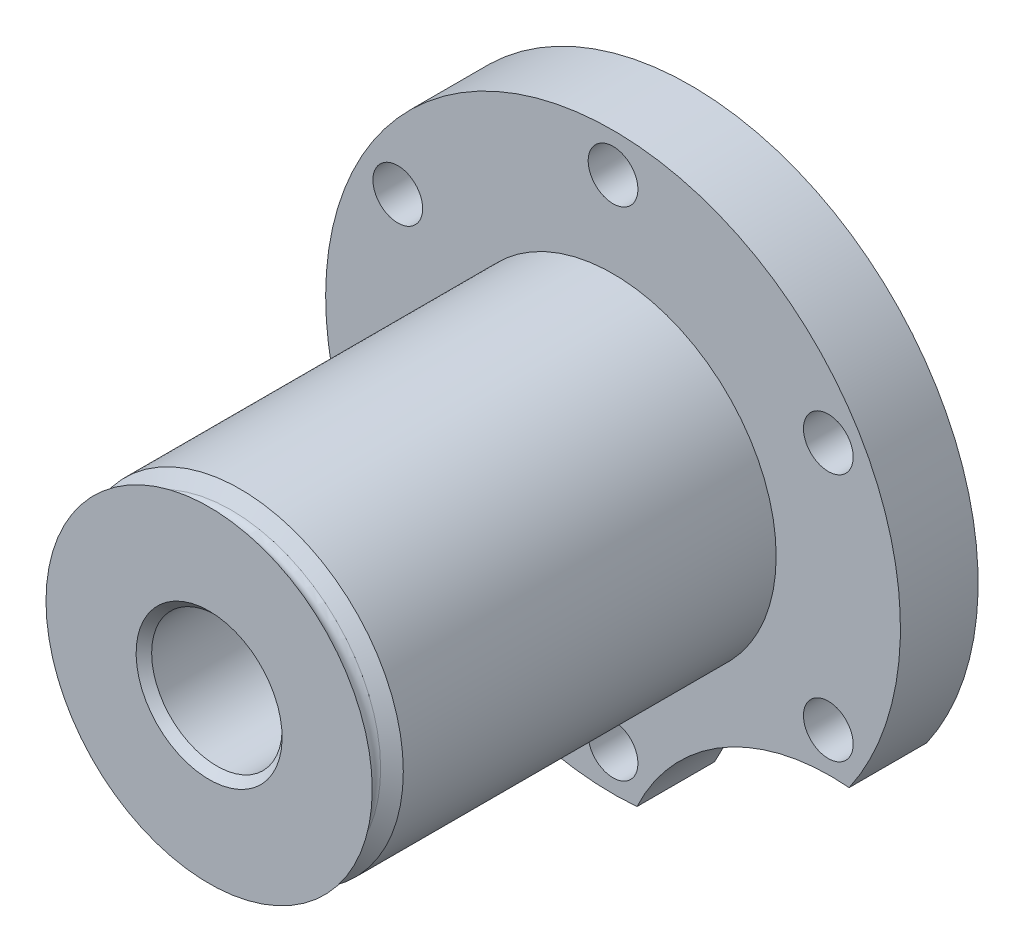
ISO-10303-21;
HEADER;
FILE_DESCRIPTION(('STEP AP214'),'2;1');
FILE_NAME('part.step','',(''),(''),'','','');
FILE_SCHEMA(('AUTOMOTIVE_DESIGN { 1 0 10303 214 1 1 1 1 }'));
ENDSEC;
DATA;
#1=APPLICATION_CONTEXT('core data for automotive mechanical design processes');
#2=APPLICATION_PROTOCOL_DEFINITION('international standard','automotive_design',2000,#1);
#3=PRODUCT_CONTEXT('',#1,'mechanical');
#4=PRODUCT('Part','Part','',(#3));
#5=PRODUCT_RELATED_PRODUCT_CATEGORY('part','',(#4));
#6=PRODUCT_DEFINITION_FORMATION('','',#4);
#7=PRODUCT_DEFINITION_CONTEXT('part definition',#1,'design');
#8=PRODUCT_DEFINITION('design','',#6,#7);
#9=PRODUCT_DEFINITION_SHAPE('','',#8);
#10=(LENGTH_UNIT() NAMED_UNIT(*) SI_UNIT(.MILLI.,.METRE.));
#11=(NAMED_UNIT(*) PLANE_ANGLE_UNIT() SI_UNIT($,.RADIAN.));
#12=(NAMED_UNIT(*) SI_UNIT($,.STERADIAN.) SOLID_ANGLE_UNIT());
#13=UNCERTAINTY_MEASURE_WITH_UNIT(LENGTH_MEASURE(1.E-05),#10,'distance_accuracy_value','');
#14=(GEOMETRIC_REPRESENTATION_CONTEXT(3) GLOBAL_UNCERTAINTY_ASSIGNED_CONTEXT((#13)) GLOBAL_UNIT_ASSIGNED_CONTEXT((#10,
#11,#12)) REPRESENTATION_CONTEXT('',''));
#15=CARTESIAN_POINT('',(0.,0.,0.));
#16=DIRECTION('',(0.,0.,1.));
#17=DIRECTION('',(1.,0.,0.));
#18=AXIS2_PLACEMENT_3D('',#15,#16,#17);
#19=CARTESIAN_POINT('',(0.,0.,0.));
#20=DIRECTION('',(0.,0.,1.));
#21=DIRECTION('',(-0.500000000000032,0.86602540378442,0.));
#22=AXIS2_PLACEMENT_3D('',#19,#20,#21);
#23=CYLINDRICAL_SURFACE('',#22,18.5);
#24=CARTESIAN_POINT('',(0.,0.,0.));
#25=DIRECTION('',(0.,0.,-1.));
#26=DIRECTION('',(0.0831961615416768,-0.996533189966461,0.));
#27=AXIS2_PLACEMENT_3D('',#24,#25,#26);
#28=CIRCLE('',#27,18.5);
#29=CARTESIAN_POINT('',(1.539128988521,-18.43586401438,0.));
#30=VERTEX_POINT('',#29);
#31=CARTESIAN_POINT('',(15.19636208291,-10.55085681095,0.));
#32=VERTEX_POINT('',#31);
#33=EDGE_CURVE('E164',#30,#32,#28,.T.);
#34=ORIENTED_EDGE('',*,*,#33,.F.);
#35=DIRECTION('',(0.,0.,1.));
#36=VECTOR('',#35,1.);
#37=CARTESIAN_POINT('',(1.539128988521,-18.43586401438,0.));
#38=LINE('',#37,#36);
#39=CARTESIAN_POINT('',(1.539128988521,-18.43586401438,5.));
#40=VERTEX_POINT('',#39);
#41=EDGE_CURVE('E27',#30,#40,#38,.T.);
#42=ORIENTED_EDGE('',*,*,#41,.T.);
#43=CARTESIAN_POINT('',(0.,0.,5.));
#44=DIRECTION('',(0.,0.,1.));
#45=DIRECTION('',(0.821424977454463,-0.570316584375674,0.));
#46=AXIS2_PLACEMENT_3D('',#43,#44,#45);
#47=CIRCLE('',#46,18.5);
#48=CARTESIAN_POINT('',(15.19636208291,-10.55085681095,5.));
#49=VERTEX_POINT('',#48);
#50=EDGE_CURVE('E158',#49,#40,#47,.T.);
#51=ORIENTED_EDGE('',*,*,#50,.F.);
#52=DIRECTION('',(0.,0.,1.));
#53=VECTOR('',#52,1.);
#54=CARTESIAN_POINT('',(15.19636208291,-10.55085681095,0.));
#55=LINE('',#54,#53);
#56=EDGE_CURVE('E11',#32,#49,#55,.T.);
#57=ORIENTED_EDGE('',*,*,#56,.F.);
#58=EDGE_LOOP('',(#34,#42,#51,#57));
#59=FACE_BOUND('',#58,.T.);
#60=ADVANCED_FACE('F17',(#59),#23,.T.);
#61=CARTESIAN_POINT('',(14.,-24.24871130596,0.));
#62=DIRECTION('',(0.,0.,1.));
#63=DIRECTION('',(1.,0.,0.));
#64=AXIS2_PLACEMENT_3D('',#61,#62,#63);
#65=CYLINDRICAL_SURFACE('',#64,13.75);
#66=ORIENTED_EDGE('',*,*,#41,.F.);
#67=CARTESIAN_POINT('',(14.,-24.24871130596,0.));
#68=DIRECTION('',(0.,0.,1.));
#69=DIRECTION('',(0.0870081514841798,0.996207599637398,0.));
#70=AXIS2_PLACEMENT_3D('',#67,#68,#69);
#71=CIRCLE('',#70,13.75);
#72=EDGE_CURVE('E160',#32,#30,#71,.T.);
#73=ORIENTED_EDGE('',*,*,#72,.F.);
#74=ORIENTED_EDGE('',*,*,#56,.T.);
#75=CARTESIAN_POINT('',(14.,-24.24871130596,5.));
#76=DIRECTION('',(0.,0.,1.));
#77=DIRECTION('',(0.0870081514841798,0.996207599637398,0.));
#78=AXIS2_PLACEMENT_3D('',#75,#76,#77);
#79=CIRCLE('',#78,13.75);
#80=EDGE_CURVE('E154',#49,#40,#79,.T.);
#81=ORIENTED_EDGE('',*,*,#80,.T.);
#82=EDGE_LOOP('',(#66,#73,#74,#81));
#83=FACE_BOUND('',#82,.T.);
#84=ADVANCED_FACE('F332',(#83),#65,.F.);
#85=CARTESIAN_POINT('',(13.85640646055,-8.,0.));
#86=DIRECTION('',(0.,0.,1.));
#87=DIRECTION('',(0.500000000000017,-0.866025403784429,0.));
#88=AXIS2_PLACEMENT_3D('',#85,#86,#87);
#89=CYLINDRICAL_SURFACE('',#88,1.6);
#90=CARTESIAN_POINT('',(13.85640646055,-8.,0.));
#91=DIRECTION('',(0.,0.,1.));
#92=DIRECTION('',(0.500000000000017,-0.866025403784429,0.));
#93=AXIS2_PLACEMENT_3D('',#90,#91,#92);
#94=CIRCLE('',#93,1.6);
#95=CARTESIAN_POINT('',(13.05640646055,-6.614359353945,0.));
#96=VERTEX_POINT('',#95);
#97=EDGE_CURVE('E171',#96,#96,#94,.T.);
#98=ORIENTED_EDGE('',*,*,#97,.F.);
#99=DIRECTION('',(0.,0.,1.));
#100=VECTOR('',#99,1.);
#101=CARTESIAN_POINT('',(13.05640646055,-6.61435935394491,0.));
#102=LINE('',#101,#100);
#103=CARTESIAN_POINT('',(13.05640646055,-6.614359353945,5.));
#104=VERTEX_POINT('',#103);
#105=EDGE_CURVE('E191',#96,#104,#102,.T.);
#106=ORIENTED_EDGE('',*,*,#105,.T.);
#107=CARTESIAN_POINT('',(13.85640646055,-8.,5.));
#108=DIRECTION('',(0.,0.,1.));
#109=DIRECTION('',(0.500000000000017,-0.866025403784429,0.));
#110=AXIS2_PLACEMENT_3D('',#107,#108,#109);
#111=CIRCLE('',#110,1.6);
#112=EDGE_CURVE('E180',#104,#104,#111,.T.);
#113=ORIENTED_EDGE('',*,*,#112,.T.);
#114=ORIENTED_EDGE('',*,*,#105,.F.);
#115=EDGE_LOOP('',(#98,#106,#113,#114));
#116=FACE_BOUND('',#115,.T.);
#117=ADVANCED_FACE('F534',(#116),#89,.F.);
#118=CARTESIAN_POINT('',(0.,-16.,0.));
#119=DIRECTION('',(0.,0.,1.));
#120=DIRECTION('',(-0.500000000000017,-0.866025403784429,0.));
#121=AXIS2_PLACEMENT_3D('',#118,#119,#120);
#122=CYLINDRICAL_SURFACE('',#121,1.6);
#123=CARTESIAN_POINT('',(0.,-16.,0.));
#124=DIRECTION('',(0.,0.,1.));
#125=DIRECTION('',(-0.500000000000017,-0.866025403784429,0.));
#126=AXIS2_PLACEMENT_3D('',#123,#124,#125);
#127=CIRCLE('',#126,1.6);
#128=CARTESIAN_POINT('',(0.8,-14.61435935394,0.));
#129=VERTEX_POINT('',#128);
#130=EDGE_CURVE('E175',#129,#129,#127,.T.);
#131=ORIENTED_EDGE('',*,*,#130,.F.);
#132=DIRECTION('',(0.,0.,1.));
#133=VECTOR('',#132,1.);
#134=CARTESIAN_POINT('',(0.800000000000027,-14.6143593539449,0.));
#135=LINE('',#134,#133);
#136=CARTESIAN_POINT('',(0.8,-14.61435935394,5.));
#137=VERTEX_POINT('',#136);
#138=EDGE_CURVE('E194',#129,#137,#135,.T.);
#139=ORIENTED_EDGE('',*,*,#138,.T.);
#140=CARTESIAN_POINT('',(0.,-16.,5.));
#141=DIRECTION('',(0.,0.,1.));
#142=DIRECTION('',(-0.500000000000017,-0.866025403784429,0.));
#143=AXIS2_PLACEMENT_3D('',#140,#141,#142);
#144=CIRCLE('',#143,1.6);
#145=EDGE_CURVE('E176',#137,#137,#144,.T.);
#146=ORIENTED_EDGE('',*,*,#145,.T.);
#147=ORIENTED_EDGE('',*,*,#138,.F.);
#148=EDGE_LOOP('',(#131,#139,#146,#147));
#149=FACE_BOUND('',#148,.T.);
#150=ADVANCED_FACE('F528',(#149),#122,.F.);
#151=CARTESIAN_POINT('',(-13.85640646055,-8.,0.));
#152=DIRECTION('',(0.,0.,1.));
#153=DIRECTION('',(-1.,0.,0.));
#154=AXIS2_PLACEMENT_3D('',#151,#152,#153);
#155=CYLINDRICAL_SURFACE('',#154,1.6);
#156=CARTESIAN_POINT('',(-13.85640646055,-8.,0.));
#157=DIRECTION('',(0.,0.,1.));
#158=DIRECTION('',(-1.,0.,0.));
#159=AXIS2_PLACEMENT_3D('',#156,#157,#158);
#160=CIRCLE('',#159,1.6);
#161=CARTESIAN_POINT('',(-12.25640646055,-8.,0.));
#162=VERTEX_POINT('',#161);
#163=EDGE_CURVE('E204',#162,#162,#160,.T.);
#164=ORIENTED_EDGE('',*,*,#163,.F.);
#165=DIRECTION('',(0.,0.,1.));
#166=VECTOR('',#165,1.);
#167=CARTESIAN_POINT('',(-12.25640646055,-8.,0.));
#168=LINE('',#167,#166);
#169=CARTESIAN_POINT('',(-12.25640646055,-8.,5.));
#170=VERTEX_POINT('',#169);
#171=EDGE_CURVE('E148',#162,#170,#168,.T.);
#172=ORIENTED_EDGE('',*,*,#171,.T.);
#173=CARTESIAN_POINT('',(-13.85640646055,-8.,5.));
#174=DIRECTION('',(0.,0.,1.));
#175=DIRECTION('',(-1.,0.,0.));
#176=AXIS2_PLACEMENT_3D('',#173,#174,#175);
#177=CIRCLE('',#176,1.6);
#178=EDGE_CURVE('E181',#170,#170,#177,.T.);
#179=ORIENTED_EDGE('',*,*,#178,.T.);
#180=ORIENTED_EDGE('',*,*,#171,.F.);
#181=EDGE_LOOP('',(#164,#172,#179,#180));
#182=FACE_BOUND('',#181,.T.);
#183=ADVANCED_FACE('F533',(#182),#155,.F.);
#184=CARTESIAN_POINT('',(-13.85640646055,8.,0.));
#185=DIRECTION('',(0.,0.,1.));
#186=DIRECTION('',(-0.500000000000017,0.866025403784429,0.));
#187=AXIS2_PLACEMENT_3D('',#184,#185,#186);
#188=CYLINDRICAL_SURFACE('',#187,1.6);
#189=CARTESIAN_POINT('',(-13.85640646055,8.,0.));
#190=DIRECTION('',(0.,0.,1.));
#191=DIRECTION('',(-0.500000000000017,0.866025403784429,0.));
#192=AXIS2_PLACEMENT_3D('',#189,#190,#191);
#193=CIRCLE('',#192,1.6);
#194=CARTESIAN_POINT('',(-13.05640646055,6.614359353945,0.));
#195=VERTEX_POINT('',#194);
#196=EDGE_CURVE('E208',#195,#195,#193,.T.);
#197=ORIENTED_EDGE('',*,*,#196,.F.);
#198=DIRECTION('',(0.,0.,1.));
#199=VECTOR('',#198,1.);
#200=CARTESIAN_POINT('',(-13.05640646055,6.61435935394491,0.));
#201=LINE('',#200,#199);
#202=CARTESIAN_POINT('',(-13.05640646055,6.614359353945,5.));
#203=VERTEX_POINT('',#202);
#204=EDGE_CURVE('E141',#195,#203,#201,.T.);
#205=ORIENTED_EDGE('',*,*,#204,.T.);
#206=CARTESIAN_POINT('',(-13.85640646055,8.,5.));
#207=DIRECTION('',(0.,0.,1.));
#208=DIRECTION('',(-0.500000000000017,0.866025403784429,0.));
#209=AXIS2_PLACEMENT_3D('',#206,#207,#208);
#210=CIRCLE('',#209,1.6);
#211=EDGE_CURVE('E185',#203,#203,#210,.T.);
#212=ORIENTED_EDGE('',*,*,#211,.T.);
#213=ORIENTED_EDGE('',*,*,#204,.F.);
#214=EDGE_LOOP('',(#197,#205,#212,#213));
#215=FACE_BOUND('',#214,.T.);
#216=ADVANCED_FACE('F541',(#215),#188,.F.);
#217=CARTESIAN_POINT('',(0.,16.,0.));
#218=DIRECTION('',(0.,0.,1.));
#219=DIRECTION('',(0.500000000000017,0.866025403784429,0.));
#220=AXIS2_PLACEMENT_3D('',#217,#218,#219);
#221=CYLINDRICAL_SURFACE('',#220,1.6);
#222=CARTESIAN_POINT('',(0.,16.,0.));
#223=DIRECTION('',(0.,0.,1.));
#224=DIRECTION('',(0.500000000000017,0.866025403784429,0.));
#225=AXIS2_PLACEMENT_3D('',#222,#223,#224);
#226=CIRCLE('',#225,1.6);
#227=CARTESIAN_POINT('',(-0.8,14.61435935394,0.));
#228=VERTEX_POINT('',#227);
#229=EDGE_CURVE('E139',#228,#228,#226,.T.);
#230=ORIENTED_EDGE('',*,*,#229,.F.);
#231=DIRECTION('',(0.,0.,1.));
#232=VECTOR('',#231,1.);
#233=CARTESIAN_POINT('',(-0.800000000000027,14.6143593539449,0.));
#234=LINE('',#233,#232);
#235=CARTESIAN_POINT('',(-0.8,14.61435935394,5.));
#236=VERTEX_POINT('',#235);
#237=EDGE_CURVE('E134',#228,#236,#234,.T.);
#238=ORIENTED_EDGE('',*,*,#237,.T.);
#239=CARTESIAN_POINT('',(0.,16.,5.));
#240=DIRECTION('',(0.,0.,1.));
#241=DIRECTION('',(0.500000000000017,0.866025403784429,0.));
#242=AXIS2_PLACEMENT_3D('',#239,#240,#241);
#243=CIRCLE('',#242,1.6);
#244=EDGE_CURVE('E137',#236,#236,#243,.T.);
#245=ORIENTED_EDGE('',*,*,#244,.T.);
#246=ORIENTED_EDGE('',*,*,#237,.F.);
#247=EDGE_LOOP('',(#230,#238,#245,#246));
#248=FACE_BOUND('',#247,.T.);
#249=ADVANCED_FACE('F135',(#248),#221,.F.);
#250=CARTESIAN_POINT('',(0.,0.,0.2500000014544));
#251=DIRECTION('',(0.,0.,-1.));
#252=DIRECTION('',(0.,-1.,0.));
#253=AXIS2_PLACEMENT_3D('',#250,#251,#252);
#254=CONICAL_SURFACE('',#253,4.449999998546,0.785398163397448);
#255=CARTESIAN_POINT('',(0.,0.,0.5));
#256=DIRECTION('',(0.,0.,1.));
#257=DIRECTION('',(-1.,0.,0.));
#258=AXIS2_PLACEMENT_3D('',#255,#256,#257);
#259=CIRCLE('',#258,4.2);
#260=CARTESIAN_POINT('',(-4.2,0.,0.5));
#261=VERTEX_POINT('',#260);
#262=CARTESIAN_POINT('',(0.,4.2000000000002,0.5000000000002));
#263=VERTEX_POINT('',#262);
#264=EDGE_CURVE('E221',#261,#263,#259,.T.);
#265=ORIENTED_EDGE('',*,*,#264,.T.);
#266=DIRECTION('',(0.,0.707106781186548,-0.707106781186548));
#267=VECTOR('',#266,1.);
#268=CARTESIAN_POINT('',(0.,4.449999998546,0.2500000014544));
#269=LINE('',#268,#267);
#270=CARTESIAN_POINT('',(0.,4.7000000000002,1.99458505267813E-13));
#271=VERTEX_POINT('',#270);
#272=EDGE_CURVE('E41',#263,#271,#269,.T.);
#273=ORIENTED_EDGE('',*,*,#272,.T.);
#274=CARTESIAN_POINT('',(0.,0.,0.));
#275=DIRECTION('',(0.,0.,1.));
#276=DIRECTION('',(1.,0.,0.));
#277=AXIS2_PLACEMENT_3D('',#274,#275,#276);
#278=CIRCLE('',#277,4.7);
#279=EDGE_CURVE('E20',#271,#271,#278,.T.);
#280=ORIENTED_EDGE('',*,*,#279,.F.);
#281=ORIENTED_EDGE('',*,*,#272,.F.);
#282=CARTESIAN_POINT('',(0.,0.,0.5));
#283=DIRECTION('',(0.,0.,1.));
#284=DIRECTION('',(-1.,0.,0.));
#285=AXIS2_PLACEMENT_3D('',#282,#283,#284);
#286=CIRCLE('',#285,4.2);
#287=EDGE_CURVE('E150',#263,#261,#286,.T.);
#288=ORIENTED_EDGE('',*,*,#287,.T.);
#289=EDGE_LOOP('',(#265,#273,#280,#281,#288));
#290=FACE_BOUND('',#289,.T.);
#291=ADVANCED_FACE('F519',(#290),#254,.F.);
#292=CARTESIAN_POINT('',(0.,0.,0.));
#293=DIRECTION('',(0.,0.,1.));
#294=DIRECTION('',(1.,0.,0.));
#295=AXIS2_PLACEMENT_3D('',#292,#293,#294);
#296=CYLINDRICAL_SURFACE('',#295,4.2);
#297=ORIENTED_EDGE('',*,*,#264,.F.);
#298=DIRECTION('',(0.,0.,1.));
#299=VECTOR('',#298,1.);
#300=CARTESIAN_POINT('',(-4.2,0.,0.));
#301=LINE('',#300,#299);
#302=CARTESIAN_POINT('',(-4.2,0.,30.5));
#303=VERTEX_POINT('',#302);
#304=EDGE_CURVE('E214',#261,#303,#301,.T.);
#305=ORIENTED_EDGE('',*,*,#304,.T.);
#306=CARTESIAN_POINT('',(0.,0.,30.5));
#307=DIRECTION('',(0.,0.,-1.));
#308=DIRECTION('',(-1.,0.,0.));
#309=AXIS2_PLACEMENT_3D('',#306,#307,#308);
#310=CIRCLE('',#309,4.2);
#311=CARTESIAN_POINT('',(0.,4.199999999998,30.500000000002));
#312=VERTEX_POINT('',#311);
#313=EDGE_CURVE('E170',#312,#303,#310,.T.);
#314=ORIENTED_EDGE('',*,*,#313,.F.);
#315=CARTESIAN_POINT('',(0.,0.,30.5));
#316=DIRECTION('',(0.,0.,-1.));
#317=DIRECTION('',(-1.,0.,0.));
#318=AXIS2_PLACEMENT_3D('',#315,#316,#317);
#319=CIRCLE('',#318,4.2);
#320=EDGE_CURVE('E165',#303,#312,#319,.T.);
#321=ORIENTED_EDGE('',*,*,#320,.F.);
#322=ORIENTED_EDGE('',*,*,#304,.F.);
#323=ORIENTED_EDGE('',*,*,#287,.F.);
#324=EDGE_LOOP('',(#297,#305,#314,#321,#322,#323));
#325=FACE_BOUND('',#324,.T.);
#326=ADVANCED_FACE('F480',(#325),#296,.F.);
#327=CARTESIAN_POINT('',(0.,0.,30.74999999855));
#328=DIRECTION('',(0.,0.,1.));
#329=DIRECTION('',(0.,-1.,0.));
#330=AXIS2_PLACEMENT_3D('',#327,#328,#329);
#331=CONICAL_SURFACE('',#330,4.449999998546,0.785398163397448);
#332=ORIENTED_EDGE('',*,*,#313,.T.);
#333=ORIENTED_EDGE('',*,*,#320,.T.);
#334=DIRECTION('',(0.,0.707106781186548,0.707106781186548));
#335=VECTOR('',#334,1.);
#336=CARTESIAN_POINT('',(0.,4.449999998546,30.74999999855));
#337=LINE('',#336,#335);
#338=CARTESIAN_POINT('',(0.,4.699999999998,31.000000000002));
#339=VERTEX_POINT('',#338);
#340=EDGE_CURVE('E169',#312,#339,#337,.T.);
#341=ORIENTED_EDGE('',*,*,#340,.T.);
#342=CARTESIAN_POINT('',(0.,0.,31.));
#343=DIRECTION('',(0.,0.,-1.));
#344=DIRECTION('',(-1.,0.,0.));
#345=AXIS2_PLACEMENT_3D('',#342,#343,#344);
#346=CIRCLE('',#345,4.7);
#347=EDGE_CURVE('E186',#339,#339,#346,.T.);
#348=ORIENTED_EDGE('',*,*,#347,.F.);
#349=ORIENTED_EDGE('',*,*,#340,.F.);
#350=EDGE_LOOP('',(#332,#333,#341,#348,#349));
#351=FACE_BOUND('',#350,.T.);
#352=ADVANCED_FACE('F474',(#351),#331,.F.);
#353=CARTESIAN_POINT('',(0.,0.,31.));
#354=DIRECTION('',(0.,0.,1.));
#355=DIRECTION('',(1.,0.,0.));
#356=AXIS2_PLACEMENT_3D('',#353,#354,#355);
#357=PLANE('',#356);
#358=ORIENTED_EDGE('',*,*,#347,.T.);
#359=EDGE_LOOP('',(#358));
#360=FACE_BOUND('',#359,.T.);
#361=CARTESIAN_POINT('',(0.,0.,31.));
#362=DIRECTION('',(0.,0.,-1.));
#363=DIRECTION('',(-1.,0.,0.));
#364=AXIS2_PLACEMENT_3D('',#361,#362,#363);
#365=CIRCLE('',#364,10.5);
#366=CARTESIAN_POINT('',(10.5,0.,31.));
#367=VERTEX_POINT('',#366);
#368=EDGE_CURVE('E278',#367,#367,#365,.T.);
#369=ORIENTED_EDGE('',*,*,#368,.F.);
#370=EDGE_LOOP('',(#369));
#371=FACE_BOUND('',#370,.T.);
#372=ADVANCED_FACE('F479',(#360,#371),#357,.T.);
#373=CARTESIAN_POINT('',(0.,0.,30.70801257358));
#374=DIRECTION('',(0.,0.,1.));
#375=DIRECTION('',(-1.,0.,0.));
#376=AXIS2_PLACEMENT_3D('',#373,#374,#375);
#377=CONICAL_SURFACE('',#376,10.06201886038,0.982793723247326);
#378=ORIENTED_EDGE('',*,*,#368,.T.);
#379=DIRECTION('',(-0.832050294337842,0.,-0.554700196225232));
#380=VECTOR('',#379,1.);
#381=CARTESIAN_POINT('',(10.06201886038,0.,30.70801257358));
#382=LINE('',#381,#380);
#383=CARTESIAN_POINT('',(9.62403772075669,0.,30.4160251471645));
#384=VERTEX_POINT('',#383);
#385=EDGE_CURVE('E190',#367,#384,#382,.T.);
#386=ORIENTED_EDGE('',*,*,#385,.T.);
#387=CARTESIAN_POINT('',(0.,0.,30.41602514717));
#388=DIRECTION('',(0.,0.,-1.));
#389=DIRECTION('',(-1.,0.,0.));
#390=AXIS2_PLACEMENT_3D('',#387,#388,#389);
#391=CIRCLE('',#390,9.624037720753);
#392=CARTESIAN_POINT('',(9.62359503425264,0.0923074600699649,30.41602514717));
#393=VERTEX_POINT('',#392);
#394=EDGE_CURVE('E222',#393,#384,#391,.T.);
#395=ORIENTED_EDGE('',*,*,#394,.F.);
#396=CARTESIAN_POINT('',(0.,0.,30.41602514717));
#397=DIRECTION('',(0.,0.,-1.));
#398=DIRECTION('',(-1.,0.,0.));
#399=AXIS2_PLACEMENT_3D('',#396,#397,#398);
#400=CIRCLE('',#399,9.624037720753);
#401=EDGE_CURVE('E226',#384,#393,#400,.T.);
#402=ORIENTED_EDGE('',*,*,#401,.F.);
#403=ORIENTED_EDGE('',*,*,#385,.F.);
#404=EDGE_LOOP('',(#378,#386,#395,#402,#403));
#405=FACE_BOUND('',#404,.T.);
#406=ADVANCED_FACE('F299',(#405),#377,.T.);
#407=CARTESIAN_POINT('',(0.,0.,30.));
#408=DIRECTION('',(0.,0.,-1.));
#409=DIRECTION('',(-0.99995400199862,-0.00959134437627119,0.));
#410=AXIS2_PLACEMENT_3D('',#407,#408,#409);
#411=TOROIDAL_SURFACE('',#410,9.901387818866,0.5);
#412=CARTESIAN_POINT('',(0.,0.,29.58397485283));
#413=DIRECTION('',(0.,0.,-1.));
#414=DIRECTION('',(-1.,0.,0.));
#415=AXIS2_PLACEMENT_3D('',#412,#413,#414);
#416=CIRCLE('',#415,9.624037720753);
#417=CARTESIAN_POINT('',(-9.624037720753,0.,29.58397485283));
#418=VERTEX_POINT('',#417);
#419=CARTESIAN_POINT('',(9.62359503425264,0.0923074600699649,29.58397485283));
#420=VERTEX_POINT('',#419);
#421=EDGE_CURVE('E201',#418,#420,#416,.T.);
#422=ORIENTED_EDGE('',*,*,#421,.F.);
#423=CARTESIAN_POINT('',(0.,0.,29.58397485283));
#424=DIRECTION('',(0.,0.,-1.));
#425=DIRECTION('',(-1.,0.,0.));
#426=AXIS2_PLACEMENT_3D('',#423,#424,#425);
#427=CIRCLE('',#426,9.624037720753);
#428=EDGE_CURVE('E197',#420,#418,#427,.T.);
#429=ORIENTED_EDGE('',*,*,#428,.F.);
#430=CARTESIAN_POINT('',(9.90093237481544,0.0949676203737593,30.));
#431=DIRECTION('',(-0.00959134437627107,0.99995400199862,0.));
#432=DIRECTION('',(0.99995400199862,0.00959134437627107,0.));
#433=AXIS2_PLACEMENT_3D('',#430,#431,#432);
#434=CIRCLE('',#433,0.5);
#435=EDGE_CURVE('E200',#420,#393,#434,.T.);
#436=ORIENTED_EDGE('',*,*,#435,.T.);
#437=ORIENTED_EDGE('',*,*,#394,.T.);
#438=ORIENTED_EDGE('',*,*,#401,.T.);
#439=ORIENTED_EDGE('',*,*,#435,.F.);
#440=EDGE_LOOP('',(#422,#429,#436,#437,#438,#439));
#441=FACE_BOUND('',#440,.T.);
#442=ADVANCED_FACE('F296',(#441),#411,.F.);
#443=CARTESIAN_POINT('',(0.,0.,29.29198742642));
#444=DIRECTION('',(0.,0.,-1.));
#445=DIRECTION('',(1.,0.,0.));
#446=AXIS2_PLACEMENT_3D('',#443,#444,#445);
#447=CONICAL_SURFACE('',#446,10.06201886038,0.982793723247326);
#448=CARTESIAN_POINT('',(0.,0.,29.));
#449=DIRECTION('',(0.,0.,1.));
#450=DIRECTION('',(1.,0.,0.));
#451=AXIS2_PLACEMENT_3D('',#448,#449,#450);
#452=CIRCLE('',#451,10.5);
#453=CARTESIAN_POINT('',(-10.5,0.,29.));
#454=VERTEX_POINT('',#453);
#455=EDGE_CURVE('E257',#454,#454,#452,.T.);
#456=ORIENTED_EDGE('',*,*,#455,.T.);
#457=DIRECTION('',(0.832050294337842,0.,0.554700196225232));
#458=VECTOR('',#457,1.);
#459=CARTESIAN_POINT('',(-10.06201886038,0.,29.29198742642));
#460=LINE('',#459,#458);
#461=EDGE_CURVE('E218',#454,#418,#460,.T.);
#462=ORIENTED_EDGE('',*,*,#461,.T.);
#463=ORIENTED_EDGE('',*,*,#421,.T.);
#464=ORIENTED_EDGE('',*,*,#428,.T.);
#465=ORIENTED_EDGE('',*,*,#461,.F.);
#466=EDGE_LOOP('',(#456,#462,#463,#464,#465));
#467=FACE_BOUND('',#466,.T.);
#468=ADVANCED_FACE('F304',(#467),#447,.T.);
#469=CARTESIAN_POINT('',(0.,0.,5.));
#470=DIRECTION('',(0.,0.,1.));
#471=DIRECTION('',(1.,0.,0.));
#472=AXIS2_PLACEMENT_3D('',#469,#470,#471);
#473=CYLINDRICAL_SURFACE('',#472,10.5);
#474=ORIENTED_EDGE('',*,*,#455,.F.);
#475=DIRECTION('',(0.,0.,-1.));
#476=VECTOR('',#475,1.);
#477=CARTESIAN_POINT('',(-10.5,0.,5.));
#478=LINE('',#477,#476);
#479=CARTESIAN_POINT('',(-10.5,0.,5.));
#480=VERTEX_POINT('',#479);
#481=EDGE_CURVE('E261',#454,#480,#478,.T.);
#482=ORIENTED_EDGE('',*,*,#481,.T.);
#483=CARTESIAN_POINT('',(0.,0.,5.));
#484=DIRECTION('',(0.,0.,1.));
#485=DIRECTION('',(1.,0.,0.));
#486=AXIS2_PLACEMENT_3D('',#483,#484,#485);
#487=CIRCLE('',#486,10.5);
#488=EDGE_CURVE('E256',#480,#480,#487,.T.);
#489=ORIENTED_EDGE('',*,*,#488,.T.);
#490=ORIENTED_EDGE('',*,*,#481,.F.);
#491=EDGE_LOOP('',(#474,#482,#489,#490));
#492=FACE_BOUND('',#491,.T.);
#493=ADVANCED_FACE('F310',(#492),#473,.T.);
#494=CARTESIAN_POINT('',(0.,0.,5.));
#495=DIRECTION('',(0.,0.,1.));
#496=DIRECTION('',(1.,0.,0.));
#497=AXIS2_PLACEMENT_3D('',#494,#495,#496);
#498=PLANE('',#497);
#499=ORIENTED_EDGE('',*,*,#488,.F.);
#500=EDGE_LOOP('',(#499));
#501=FACE_BOUND('',#500,.T.);
#502=ORIENTED_EDGE('',*,*,#112,.F.);
#503=EDGE_LOOP('',(#502));
#504=FACE_BOUND('',#503,.T.);
#505=ORIENTED_EDGE('',*,*,#145,.F.);
#506=EDGE_LOOP('',(#505));
#507=FACE_BOUND('',#506,.T.);
#508=ORIENTED_EDGE('',*,*,#178,.F.);
#509=EDGE_LOOP('',(#508));
#510=FACE_BOUND('',#509,.T.);
#511=ORIENTED_EDGE('',*,*,#211,.F.);
#512=EDGE_LOOP('',(#511));
#513=FACE_BOUND('',#512,.T.);
#514=ORIENTED_EDGE('',*,*,#244,.F.);
#515=EDGE_LOOP('',(#514));
#516=FACE_BOUND('',#515,.T.);
#517=CARTESIAN_POINT('',(13.85640646055,8.,5.));
#518=DIRECTION('',(0.,0.,1.));
#519=DIRECTION('',(1.,0.,0.));
#520=AXIS2_PLACEMENT_3D('',#517,#518,#519);
#521=CIRCLE('',#520,1.6);
#522=CARTESIAN_POINT('',(12.25640646055,8.,5.));
#523=VERTEX_POINT('',#522);
#524=EDGE_CURVE('E159',#523,#523,#521,.T.);
#525=ORIENTED_EDGE('',*,*,#524,.F.);
#526=EDGE_LOOP('',(#525));
#527=FACE_BOUND('',#526,.T.);
#528=ORIENTED_EDGE('',*,*,#80,.F.);
#529=ORIENTED_EDGE('',*,*,#50,.T.);
#530=EDGE_LOOP('',(#528,#529));
#531=FACE_BOUND('',#530,.T.);
#532=ADVANCED_FACE('F313',(#501,#504,#507,#510,#513,#516,#527,#531),#498,.T.);
#533=CARTESIAN_POINT('',(13.85640646055,8.,0.));
#534=DIRECTION('',(0.,0.,1.));
#535=DIRECTION('',(1.,0.,0.));
#536=AXIS2_PLACEMENT_3D('',#533,#534,#535);
#537=CYLINDRICAL_SURFACE('',#536,1.6);
#538=CARTESIAN_POINT('',(13.85640646055,8.,0.));
#539=DIRECTION('',(0.,0.,1.));
#540=DIRECTION('',(1.,0.,0.));
#541=AXIS2_PLACEMENT_3D('',#538,#539,#540);
#542=CIRCLE('',#541,1.6);
#543=CARTESIAN_POINT('',(12.25640646055,8.,0.));
#544=VERTEX_POINT('',#543);
#545=EDGE_CURVE('E250',#544,#544,#542,.T.);
#546=ORIENTED_EDGE('',*,*,#545,.F.);
#547=DIRECTION('',(0.,0.,1.));
#548=VECTOR('',#547,1.);
#549=CARTESIAN_POINT('',(12.25640646055,8.,0.));
#550=LINE('',#549,#548);
#551=EDGE_CURVE('E246',#544,#523,#550,.T.);
#552=ORIENTED_EDGE('',*,*,#551,.T.);
#553=ORIENTED_EDGE('',*,*,#524,.T.);
#554=ORIENTED_EDGE('',*,*,#551,.F.);
#555=EDGE_LOOP('',(#546,#552,#553,#554));
#556=FACE_BOUND('',#555,.T.);
#557=ADVANCED_FACE('F316',(#556),#537,.F.);
#558=CARTESIAN_POINT('',(0.,0.,0.));
#559=DIRECTION('',(0.,0.,1.));
#560=DIRECTION('',(1.,0.,0.));
#561=AXIS2_PLACEMENT_3D('',#558,#559,#560);
#562=PLANE('',#561);
#563=ORIENTED_EDGE('',*,*,#545,.T.);
#564=EDGE_LOOP('',(#563));
#565=FACE_BOUND('',#564,.T.);
#566=ORIENTED_EDGE('',*,*,#279,.T.);
#567=EDGE_LOOP('',(#566));
#568=FACE_BOUND('',#567,.T.);
#569=ORIENTED_EDGE('',*,*,#97,.T.);
#570=EDGE_LOOP('',(#569));
#571=FACE_BOUND('',#570,.T.);
#572=ORIENTED_EDGE('',*,*,#130,.T.);
#573=EDGE_LOOP('',(#572));
#574=FACE_BOUND('',#573,.T.);
#575=ORIENTED_EDGE('',*,*,#163,.T.);
#576=EDGE_LOOP('',(#575));
#577=FACE_BOUND('',#576,.T.);
#578=ORIENTED_EDGE('',*,*,#196,.T.);
#579=EDGE_LOOP('',(#578));
#580=FACE_BOUND('',#579,.T.);
#581=ORIENTED_EDGE('',*,*,#229,.T.);
#582=EDGE_LOOP('',(#581));
#583=FACE_BOUND('',#582,.T.);
#584=ORIENTED_EDGE('',*,*,#72,.T.);
#585=ORIENTED_EDGE('',*,*,#33,.T.);
#586=EDGE_LOOP('',(#584,#585));
#587=FACE_BOUND('',#586,.T.);
#588=ADVANCED_FACE('F500',(#565,#568,#571,#574,#577,#580,#583,#587),#562,.F.);
#589=CLOSED_SHELL('',(#60,#84,#117,#150,#183,#216,#249,#291,#326,#352,#372,#406,#442,#468,#493,
#532,#557,#588));
#590=MANIFOLD_SOLID_BREP('B1',#589);
#591=ADVANCED_BREP_SHAPE_REPRESENTATION('',(#18,#590),#14);
#592=SHAPE_DEFINITION_REPRESENTATION(#9,#591);
ENDSEC;
END-ISO-10303-21;
